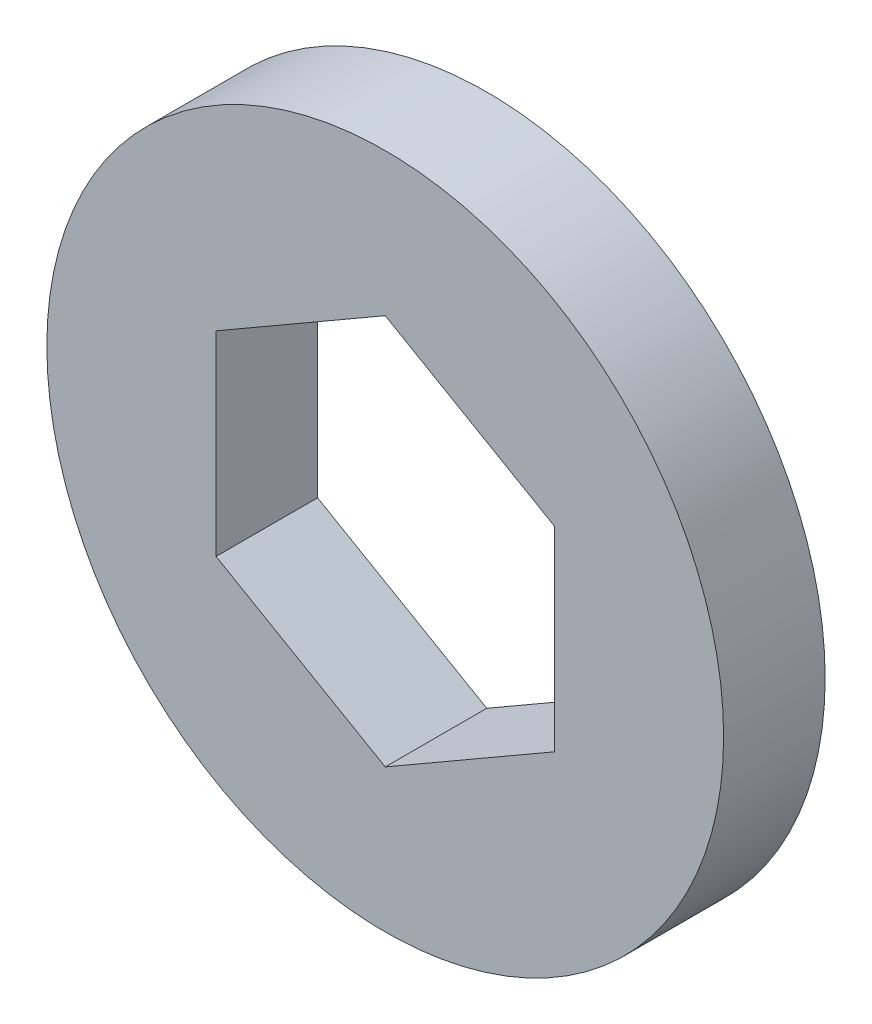
ISO-10303-21;
HEADER;
FILE_DESCRIPTION(('STEP AP214'),'2;1');
FILE_NAME('part.step','',(''),(''),'','','');
FILE_SCHEMA(('AUTOMOTIVE_DESIGN { 1 0 10303 214 1 1 1 1 }'));
ENDSEC;
DATA;
#1=APPLICATION_CONTEXT('core data for automotive mechanical design processes');
#2=APPLICATION_PROTOCOL_DEFINITION('international standard','automotive_design',2000,#1);
#3=PRODUCT_CONTEXT('',#1,'mechanical');
#4=PRODUCT('Part','Part','',(#3));
#5=PRODUCT_RELATED_PRODUCT_CATEGORY('part','',(#4));
#6=PRODUCT_DEFINITION_FORMATION('','',#4);
#7=PRODUCT_DEFINITION_CONTEXT('part definition',#1,'design');
#8=PRODUCT_DEFINITION('design','',#6,#7);
#9=PRODUCT_DEFINITION_SHAPE('','',#8);
#10=(LENGTH_UNIT() NAMED_UNIT(*) SI_UNIT(.MILLI.,.METRE.));
#11=(NAMED_UNIT(*) PLANE_ANGLE_UNIT() SI_UNIT($,.RADIAN.));
#12=(NAMED_UNIT(*) SI_UNIT($,.STERADIAN.) SOLID_ANGLE_UNIT());
#13=UNCERTAINTY_MEASURE_WITH_UNIT(LENGTH_MEASURE(1.E-05),#10,'distance_accuracy_value','');
#14=(GEOMETRIC_REPRESENTATION_CONTEXT(3) GLOBAL_UNCERTAINTY_ASSIGNED_CONTEXT((#13)) GLOBAL_UNIT_ASSIGNED_CONTEXT((#10,
#11,#12)) REPRESENTATION_CONTEXT('',''));
#15=CARTESIAN_POINT('',(0.,0.,0.));
#16=DIRECTION('',(0.,0.,1.));
#17=DIRECTION('',(1.,0.,0.));
#18=AXIS2_PLACEMENT_3D('',#15,#16,#17);
#19=CARTESIAN_POINT('',(0.,0.,15.));
#20=DIRECTION('',(0.,0.,1.));
#21=DIRECTION('',(1.,0.,0.));
#22=AXIS2_PLACEMENT_3D('',#19,#20,#21);
#23=PLANE('',#22);
#24=CARTESIAN_POINT('',(0.,0.,15.));
#25=DIRECTION('',(0.,0.,1.));
#26=DIRECTION('',(1.,0.,0.));
#27=AXIS2_PLACEMENT_3D('',#24,#25,#26);
#28=CIRCLE('',#27,50.);
#29=CARTESIAN_POINT('',(50.,0.,15.));
#30=VERTEX_POINT('',#29);
#31=EDGE_CURVE('E11',#30,#30,#28,.T.);
#32=ORIENTED_EDGE('',*,*,#31,.T.);
#33=EDGE_LOOP('',(#32));
#34=FACE_BOUND('',#33,.T.);
#35=DIRECTION('',(-0.866025403784438,-0.500000000000001,0.));
#36=VECTOR('',#35,1.);
#37=CARTESIAN_POINT('',(0.,28.8675134594813,15.));
#38=LINE('',#37,#36);
#39=CARTESIAN_POINT('',(0.,28.8675134594813,15.));
#40=VERTEX_POINT('',#39);
#41=CARTESIAN_POINT('',(-25.,14.4337567297406,15.));
#42=VERTEX_POINT('',#41);
#43=EDGE_CURVE('E102',#40,#42,#38,.T.);
#44=ORIENTED_EDGE('',*,*,#43,.F.);
#45=DIRECTION('',(-0.866025403784441,0.499999999999995,0.));
#46=VECTOR('',#45,1.);
#47=CARTESIAN_POINT('',(24.9999999999998,14.4337567297409,15.));
#48=LINE('',#47,#46);
#49=CARTESIAN_POINT('',(24.9999999999998,14.4337567297409,15.));
#50=VERTEX_POINT('',#49);
#51=EDGE_CURVE('E94',#50,#40,#48,.T.);
#52=ORIENTED_EDGE('',*,*,#51,.F.);
#53=DIRECTION('',(0.,1.,0.));
#54=VECTOR('',#53,1.);
#55=CARTESIAN_POINT('',(25.0000000000001,-14.4337567297404,15.));
#56=LINE('',#55,#54);
#57=CARTESIAN_POINT('',(25.0000000000001,-14.4337567297404,15.));
#58=VERTEX_POINT('',#57);
#59=EDGE_CURVE('E122',#58,#50,#56,.T.);
#60=ORIENTED_EDGE('',*,*,#59,.F.);
#61=DIRECTION('',(0.866025403784435,0.500000000000007,0.));
#62=VECTOR('',#61,1.);
#63=CARTESIAN_POINT('',(2.01580769085164E-13,-28.8675134594813,15.));
#64=LINE('',#63,#62);
#65=CARTESIAN_POINT('',(2.01580769085164E-13,-28.8675134594813,15.));
#66=VERTEX_POINT('',#65);
#67=EDGE_CURVE('E120',#66,#58,#64,.T.);
#68=ORIENTED_EDGE('',*,*,#67,.F.);
#69=DIRECTION('',(0.866025403784442,-0.499999999999995,0.));
#70=VECTOR('',#69,1.);
#71=CARTESIAN_POINT('',(-24.9999999999999,-14.4337567297408,15.));
#72=LINE('',#71,#70);
#73=CARTESIAN_POINT('',(-24.9999999999999,-14.4337567297408,15.));
#74=VERTEX_POINT('',#73);
#75=EDGE_CURVE('E116',#74,#66,#72,.T.);
#76=ORIENTED_EDGE('',*,*,#75,.F.);
#77=DIRECTION('',(0.,-1.,0.));
#78=VECTOR('',#77,1.);
#79=CARTESIAN_POINT('',(-25.,14.4337567297406,15.));
#80=LINE('',#79,#78);
#81=EDGE_CURVE('E114',#42,#74,#80,.T.);
#82=ORIENTED_EDGE('',*,*,#81,.F.);
#83=EDGE_LOOP('',(#44,#52,#60,#68,#76,#82));
#84=FACE_BOUND('',#83,.T.);
#85=ADVANCED_FACE('F41',(#34,#84),#23,.T.);
#86=CARTESIAN_POINT('',(0.,0.,0.));
#87=DIRECTION('',(0.,0.,1.));
#88=DIRECTION('',(1.,0.,0.));
#89=AXIS2_PLACEMENT_3D('',#86,#87,#88);
#90=PLANE('',#89);
#91=CARTESIAN_POINT('',(0.,0.,0.));
#92=DIRECTION('',(0.,0.,1.));
#93=DIRECTION('',(1.,0.,0.));
#94=AXIS2_PLACEMENT_3D('',#91,#92,#93);
#95=CIRCLE('',#94,50.);
#96=CARTESIAN_POINT('',(50.,0.,0.));
#97=VERTEX_POINT('',#96);
#98=EDGE_CURVE('E45',#97,#97,#95,.T.);
#99=ORIENTED_EDGE('',*,*,#98,.F.);
#100=EDGE_LOOP('',(#99));
#101=FACE_BOUND('',#100,.T.);
#102=DIRECTION('',(-0.866025403784441,0.499999999999995,0.));
#103=VECTOR('',#102,1.);
#104=CARTESIAN_POINT('',(24.9999999999998,14.4337567297409,0.));
#105=LINE('',#104,#103);
#106=CARTESIAN_POINT('',(24.9999999999998,14.4337567297409,0.));
#107=VERTEX_POINT('',#106);
#108=CARTESIAN_POINT('',(0.,28.8675134594813,0.));
#109=VERTEX_POINT('',#108);
#110=EDGE_CURVE('E64',#107,#109,#105,.T.);
#111=ORIENTED_EDGE('',*,*,#110,.T.);
#112=DIRECTION('',(-0.866025403784438,-0.500000000000001,0.));
#113=VECTOR('',#112,1.);
#114=CARTESIAN_POINT('',(0.,28.8675134594813,0.));
#115=LINE('',#114,#113);
#116=CARTESIAN_POINT('',(-25.,14.4337567297406,0.));
#117=VERTEX_POINT('',#116);
#118=EDGE_CURVE('E109',#109,#117,#115,.T.);
#119=ORIENTED_EDGE('',*,*,#118,.T.);
#120=DIRECTION('',(0.,-1.,0.));
#121=VECTOR('',#120,1.);
#122=CARTESIAN_POINT('',(-25.,14.4337567297406,0.));
#123=LINE('',#122,#121);
#124=CARTESIAN_POINT('',(-24.9999999999999,-14.4337567297408,0.));
#125=VERTEX_POINT('',#124);
#126=EDGE_CURVE('E126',#117,#125,#123,.T.);
#127=ORIENTED_EDGE('',*,*,#126,.T.);
#128=DIRECTION('',(0.866025403784442,-0.499999999999995,0.));
#129=VECTOR('',#128,1.);
#130=CARTESIAN_POINT('',(-24.9999999999999,-14.4337567297408,0.));
#131=LINE('',#130,#129);
#132=CARTESIAN_POINT('',(2.01580769085164E-13,-28.8675134594813,0.));
#133=VERTEX_POINT('',#132);
#134=EDGE_CURVE('E129',#125,#133,#131,.T.);
#135=ORIENTED_EDGE('',*,*,#134,.T.);
#136=DIRECTION('',(0.866025403784435,0.500000000000007,0.));
#137=VECTOR('',#136,1.);
#138=CARTESIAN_POINT('',(2.01580769085164E-13,-28.8675134594813,0.));
#139=LINE('',#138,#137);
#140=CARTESIAN_POINT('',(25.0000000000001,-14.4337567297404,0.));
#141=VERTEX_POINT('',#140);
#142=EDGE_CURVE('E132',#133,#141,#139,.T.);
#143=ORIENTED_EDGE('',*,*,#142,.T.);
#144=DIRECTION('',(0.,1.,0.));
#145=VECTOR('',#144,1.);
#146=CARTESIAN_POINT('',(25.0000000000001,-14.4337567297404,0.));
#147=LINE('',#146,#145);
#148=EDGE_CURVE('E103',#141,#107,#147,.T.);
#149=ORIENTED_EDGE('',*,*,#148,.T.);
#150=EDGE_LOOP('',(#111,#119,#127,#135,#143,#149));
#151=FACE_BOUND('',#150,.T.);
#152=ADVANCED_FACE('F149',(#101,#151),#90,.F.);
#153=CARTESIAN_POINT('',(0.,0.,15.));
#154=DIRECTION('',(0.,0.,-1.));
#155=DIRECTION('',(-1.,0.,0.));
#156=AXIS2_PLACEMENT_3D('',#153,#154,#155);
#157=CYLINDRICAL_SURFACE('',#156,50.);
#158=ORIENTED_EDGE('',*,*,#31,.F.);
#159=EDGE_LOOP('',(#158));
#160=FACE_BOUND('',#159,.T.);
#161=ORIENTED_EDGE('',*,*,#98,.T.);
#162=EDGE_LOOP('',(#161));
#163=FACE_BOUND('',#162,.T.);
#164=ADVANCED_FACE('F43',(#160,#163),#157,.T.);
#165=CARTESIAN_POINT('',(24.9999999999998,14.4337567297409,15.));
#166=DIRECTION('',(-0.499999999999995,-0.866025403784441,0.));
#167=DIRECTION('',(0.866025403784441,-0.499999999999995,0.));
#168=AXIS2_PLACEMENT_3D('',#165,#166,#167);
#169=PLANE('',#168);
#170=ORIENTED_EDGE('',*,*,#110,.F.);
#171=DIRECTION('',(0.,0.,-1.));
#172=VECTOR('',#171,1.);
#173=CARTESIAN_POINT('',(24.9999999999998,14.4337567297409,15.));
#174=LINE('',#173,#172);
#175=EDGE_CURVE('E98',#50,#107,#174,.T.);
#176=ORIENTED_EDGE('',*,*,#175,.F.);
#177=ORIENTED_EDGE('',*,*,#51,.T.);
#178=DIRECTION('',(0.,0.,-1.));
#179=VECTOR('',#178,1.);
#180=CARTESIAN_POINT('',(0.,28.8675134594813,15.));
#181=LINE('',#180,#179);
#182=EDGE_CURVE('E97',#40,#109,#181,.T.);
#183=ORIENTED_EDGE('',*,*,#182,.T.);
#184=EDGE_LOOP('',(#170,#176,#177,#183));
#185=FACE_BOUND('',#184,.T.);
#186=ADVANCED_FACE('F96',(#185),#169,.T.);
#187=CARTESIAN_POINT('',(0.,28.8675134594813,15.));
#188=DIRECTION('',(0.500000000000001,-0.866025403784438,0.));
#189=DIRECTION('',(0.866025403784438,0.500000000000001,0.));
#190=AXIS2_PLACEMENT_3D('',#187,#188,#189);
#191=PLANE('',#190);
#192=ORIENTED_EDGE('',*,*,#118,.F.);
#193=ORIENTED_EDGE('',*,*,#182,.F.);
#194=ORIENTED_EDGE('',*,*,#43,.T.);
#195=DIRECTION('',(0.,0.,-1.));
#196=VECTOR('',#195,1.);
#197=CARTESIAN_POINT('',(-25.,14.4337567297406,15.));
#198=LINE('',#197,#196);
#199=EDGE_CURVE('E110',#42,#117,#198,.T.);
#200=ORIENTED_EDGE('',*,*,#199,.T.);
#201=EDGE_LOOP('',(#192,#193,#194,#200));
#202=FACE_BOUND('',#201,.T.);
#203=ADVANCED_FACE('F106',(#202),#191,.T.);
#204=CARTESIAN_POINT('',(-25.,14.4337567297406,15.));
#205=DIRECTION('',(1.,0.,0.));
#206=DIRECTION('',(0.,1.,0.));
#207=AXIS2_PLACEMENT_3D('',#204,#205,#206);
#208=PLANE('',#207);
#209=ORIENTED_EDGE('',*,*,#126,.F.);
#210=ORIENTED_EDGE('',*,*,#199,.F.);
#211=ORIENTED_EDGE('',*,*,#81,.T.);
#212=DIRECTION('',(0.,0.,-1.));
#213=VECTOR('',#212,1.);
#214=CARTESIAN_POINT('',(-24.9999999999999,-14.4337567297408,15.));
#215=LINE('',#214,#213);
#216=EDGE_CURVE('E141',#74,#125,#215,.T.);
#217=ORIENTED_EDGE('',*,*,#216,.T.);
#218=EDGE_LOOP('',(#209,#210,#211,#217));
#219=FACE_BOUND('',#218,.T.);
#220=ADVANCED_FACE('F145',(#219),#208,.T.);
#221=CARTESIAN_POINT('',(-24.9999999999999,-14.4337567297408,15.));
#222=DIRECTION('',(0.499999999999995,0.866025403784441,0.));
#223=DIRECTION('',(-0.866025403784442,0.499999999999995,0.));
#224=AXIS2_PLACEMENT_3D('',#221,#222,#223);
#225=PLANE('',#224);
#226=ORIENTED_EDGE('',*,*,#134,.F.);
#227=ORIENTED_EDGE('',*,*,#216,.F.);
#228=ORIENTED_EDGE('',*,*,#75,.T.);
#229=DIRECTION('',(0.,0.,-1.));
#230=VECTOR('',#229,1.);
#231=CARTESIAN_POINT('',(2.01580769085164E-13,-28.8675134594813,15.));
#232=LINE('',#231,#230);
#233=EDGE_CURVE('E139',#66,#133,#232,.T.);
#234=ORIENTED_EDGE('',*,*,#233,.T.);
#235=EDGE_LOOP('',(#226,#227,#228,#234));
#236=FACE_BOUND('',#235,.T.);
#237=ADVANCED_FACE('F157',(#236),#225,.T.);
#238=CARTESIAN_POINT('',(2.01580769085164E-13,-28.8675134594813,15.));
#239=DIRECTION('',(-0.500000000000007,0.866025403784434,0.));
#240=DIRECTION('',(-0.866025403784435,-0.500000000000007,0.));
#241=AXIS2_PLACEMENT_3D('',#238,#239,#240);
#242=PLANE('',#241);
#243=ORIENTED_EDGE('',*,*,#142,.F.);
#244=ORIENTED_EDGE('',*,*,#233,.F.);
#245=ORIENTED_EDGE('',*,*,#67,.T.);
#246=DIRECTION('',(0.,0.,-1.));
#247=VECTOR('',#246,1.);
#248=CARTESIAN_POINT('',(25.0000000000001,-14.4337567297404,15.));
#249=LINE('',#248,#247);
#250=EDGE_CURVE('E56',#58,#141,#249,.T.);
#251=ORIENTED_EDGE('',*,*,#250,.T.);
#252=EDGE_LOOP('',(#243,#244,#245,#251));
#253=FACE_BOUND('',#252,.T.);
#254=ADVANCED_FACE('F155',(#253),#242,.T.);
#255=CARTESIAN_POINT('',(25.0000000000001,-14.4337567297404,15.));
#256=DIRECTION('',(-1.,0.,0.));
#257=DIRECTION('',(0.,-1.,0.));
#258=AXIS2_PLACEMENT_3D('',#255,#256,#257);
#259=PLANE('',#258);
#260=ORIENTED_EDGE('',*,*,#148,.F.);
#261=ORIENTED_EDGE('',*,*,#250,.F.);
#262=ORIENTED_EDGE('',*,*,#59,.T.);
#263=ORIENTED_EDGE('',*,*,#175,.T.);
#264=EDGE_LOOP('',(#260,#261,#262,#263));
#265=FACE_BOUND('',#264,.T.);
#266=ADVANCED_FACE('F151',(#265),#259,.T.);
#267=CLOSED_SHELL('',(#85,#152,#164,#186,#203,#220,#237,#254,#266));
#268=MANIFOLD_SOLID_BREP('B2',#267);
#269=ADVANCED_BREP_SHAPE_REPRESENTATION('',(#18,#268),#14);
#270=SHAPE_DEFINITION_REPRESENTATION(#9,#269);
ENDSEC;
END-ISO-10303-21;
